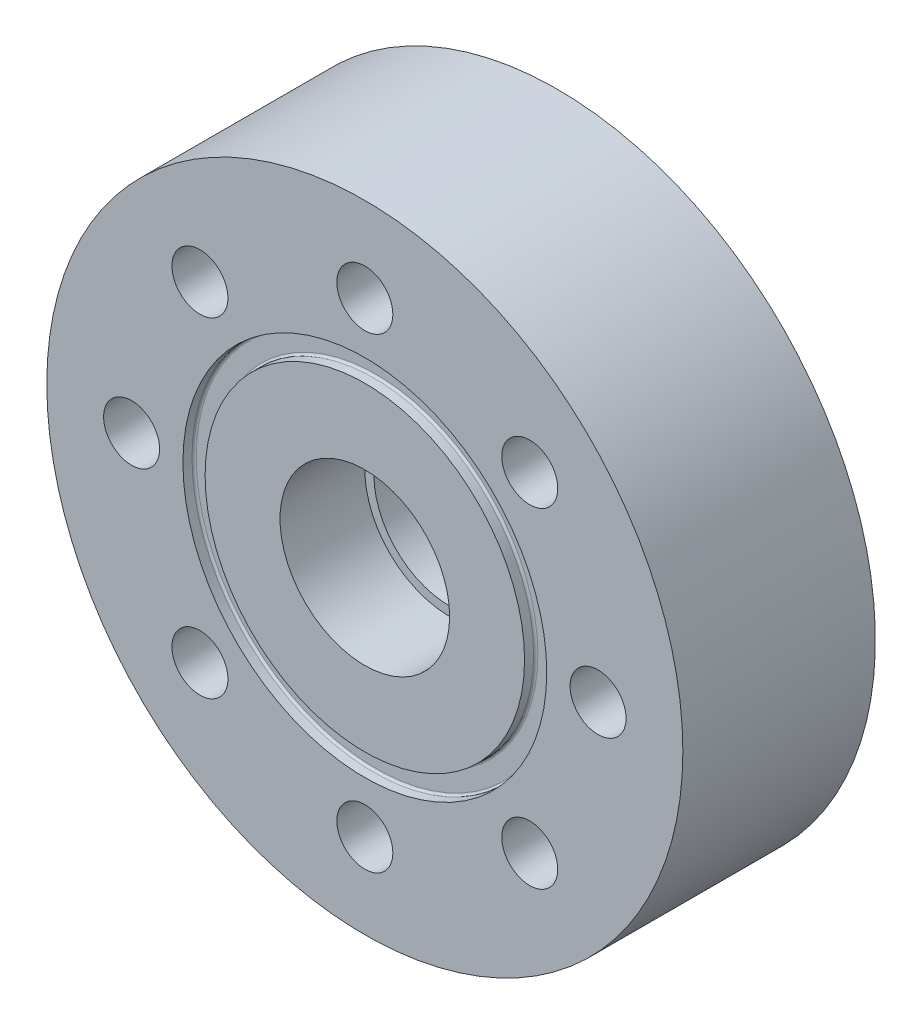
ISO-10303-21;
HEADER;
FILE_DESCRIPTION(('STEP AP214'),'2;1');
FILE_NAME('part.step','',(''),(''),'','','');
FILE_SCHEMA(('AUTOMOTIVE_DESIGN { 1 0 10303 214 1 1 1 1 }'));
ENDSEC;
DATA;
#1=APPLICATION_CONTEXT('core data for automotive mechanical design processes');
#2=APPLICATION_PROTOCOL_DEFINITION('international standard','automotive_design',2000,#1);
#3=PRODUCT_CONTEXT('',#1,'mechanical');
#4=PRODUCT('Part','Part','',(#3));
#5=PRODUCT_RELATED_PRODUCT_CATEGORY('part','',(#4));
#6=PRODUCT_DEFINITION_FORMATION('','',#4);
#7=PRODUCT_DEFINITION_CONTEXT('part definition',#1,'design');
#8=PRODUCT_DEFINITION('design','',#6,#7);
#9=PRODUCT_DEFINITION_SHAPE('','',#8);
#10=(LENGTH_UNIT() NAMED_UNIT(*) SI_UNIT(.MILLI.,.METRE.));
#11=(NAMED_UNIT(*) PLANE_ANGLE_UNIT() SI_UNIT($,.RADIAN.));
#12=(NAMED_UNIT(*) SI_UNIT($,.STERADIAN.) SOLID_ANGLE_UNIT());
#13=UNCERTAINTY_MEASURE_WITH_UNIT(LENGTH_MEASURE(1.E-05),#10,'distance_accuracy_value','');
#14=(GEOMETRIC_REPRESENTATION_CONTEXT(3) GLOBAL_UNCERTAINTY_ASSIGNED_CONTEXT((#13)) GLOBAL_UNIT_ASSIGNED_CONTEXT((#10,
#11,#12)) REPRESENTATION_CONTEXT('',''));
#15=CARTESIAN_POINT('',(0.,0.,0.));
#16=DIRECTION('',(0.,0.,1.));
#17=DIRECTION('',(1.,0.,0.));
#18=AXIS2_PLACEMENT_3D('',#15,#16,#17);
#19=CARTESIAN_POINT('',(0.,0.,10.));
#20=DIRECTION('',(0.,0.,1.));
#21=DIRECTION('',(1.,0.,0.));
#22=AXIS2_PLACEMENT_3D('',#19,#20,#21);
#23=PLANE('',#22);
#24=CARTESIAN_POINT('',(0.,0.,10.));
#25=DIRECTION('',(0.,0.,1.));
#26=DIRECTION('',(1.,0.,0.));
#27=AXIS2_PLACEMENT_3D('',#24,#25,#26);
#28=CIRCLE('',#27,10.);
#29=CARTESIAN_POINT('',(10.,0.,10.));
#30=VERTEX_POINT('',#29);
#31=EDGE_CURVE('E66',#30,#30,#28,.T.);
#32=ORIENTED_EDGE('',*,*,#31,.F.);
#33=EDGE_LOOP('',(#32));
#34=FACE_BOUND('',#33,.T.);
#35=CARTESIAN_POINT('',(0.,0.,10.));
#36=DIRECTION('',(0.,0.,1.));
#37=DIRECTION('',(1.,0.,0.));
#38=AXIS2_PLACEMENT_3D('',#35,#36,#37);
#39=CIRCLE('',#38,18.8338);
#40=CARTESIAN_POINT('',(18.8338,0.,10.));
#41=VERTEX_POINT('',#40);
#42=EDGE_CURVE('E132',#41,#41,#39,.T.);
#43=ORIENTED_EDGE('',*,*,#42,.T.);
#44=EDGE_LOOP('',(#43));
#45=FACE_BOUND('',#44,.T.);
#46=ADVANCED_FACE('F43',(#34,#45),#23,.T.);
#47=CARTESIAN_POINT('',(0.,0.,10.));
#48=DIRECTION('',(0.,0.,1.));
#49=DIRECTION('',(1.,0.,0.));
#50=AXIS2_PLACEMENT_3D('',#47,#48,#49);
#51=CIRCLE('',#50,21.45);
#52=CARTESIAN_POINT('',(21.45,0.,10.));
#53=VERTEX_POINT('',#52);
#54=EDGE_CURVE('E127',#53,#53,#51,.T.);
#55=ORIENTED_EDGE('',*,*,#54,.F.);
#56=EDGE_LOOP('',(#55));
#57=FACE_BOUND('',#56,.T.);
#58=CARTESIAN_POINT('',(-27.4999999999994,-5.69811916257121E-13,10.));
#59=DIRECTION('',(0.,0.,1.));
#60=DIRECTION('',(1.,0.,0.));
#61=AXIS2_PLACEMENT_3D('',#58,#59,#60);
#62=CIRCLE('',#61,3.302);
#63=CARTESIAN_POINT('',(-24.1979999999994,-5.69811916257121E-13,10.));
#64=VERTEX_POINT('',#63);
#65=EDGE_CURVE('E79',#64,#64,#62,.T.);
#66=ORIENTED_EDGE('',*,*,#65,.F.);
#67=EDGE_LOOP('',(#66));
#68=FACE_BOUND('',#67,.T.);
#69=CARTESIAN_POINT('',(-19.4454364826291,-19.4454364826305,10.));
#70=DIRECTION('',(0.,0.,1.));
#71=DIRECTION('',(1.,0.,0.));
#72=AXIS2_PLACEMENT_3D('',#69,#70,#71);
#73=CIRCLE('',#72,3.302);
#74=CARTESIAN_POINT('',(-16.1434364826291,-19.4454364826305,10.));
#75=VERTEX_POINT('',#74);
#76=EDGE_CURVE('E98',#75,#75,#73,.T.);
#77=ORIENTED_EDGE('',*,*,#76,.F.);
#78=EDGE_LOOP('',(#77));
#79=FACE_BOUND('',#78,.T.);
#80=CARTESIAN_POINT('',(0.,27.5,10.));
#81=DIRECTION('',(0.,0.,1.));
#82=DIRECTION('',(1.,0.,0.));
#83=AXIS2_PLACEMENT_3D('',#80,#81,#82);
#84=CIRCLE('',#83,3.302);
#85=CARTESIAN_POINT('',(3.302,27.5,10.));
#86=VERTEX_POINT('',#85);
#87=EDGE_CURVE('E92',#86,#86,#84,.T.);
#88=ORIENTED_EDGE('',*,*,#87,.F.);
#89=EDGE_LOOP('',(#88));
#90=FACE_BOUND('',#89,.T.);
#91=CARTESIAN_POINT('',(19.4454364826302,19.4454364826305,10.));
#92=DIRECTION('',(0.,0.,1.));
#93=DIRECTION('',(1.,0.,0.));
#94=AXIS2_PLACEMENT_3D('',#91,#92,#93);
#95=CIRCLE('',#94,3.302);
#96=CARTESIAN_POINT('',(22.7474364826302,19.4454364826305,10.));
#97=VERTEX_POINT('',#96);
#98=EDGE_CURVE('E85',#97,#97,#95,.T.);
#99=ORIENTED_EDGE('',*,*,#98,.F.);
#100=EDGE_LOOP('',(#99));
#101=FACE_BOUND('',#100,.T.);
#102=CARTESIAN_POINT('',(27.5000000000006,5.66444137559466E-13,10.));
#103=DIRECTION('',(0.,0.,1.));
#104=DIRECTION('',(1.,0.,0.));
#105=AXIS2_PLACEMENT_3D('',#102,#103,#104);
#106=CIRCLE('',#105,3.302);
#107=CARTESIAN_POINT('',(30.8020000000006,5.66444137559466E-13,10.));
#108=VERTEX_POINT('',#107);
#109=EDGE_CURVE('E86',#108,#108,#106,.T.);
#110=ORIENTED_EDGE('',*,*,#109,.F.);
#111=EDGE_LOOP('',(#110));
#112=FACE_BOUND('',#111,.T.);
#113=CARTESIAN_POINT('',(19.445436482631,-19.4454364826297,10.));
#114=DIRECTION('',(0.,0.,1.));
#115=DIRECTION('',(1.,0.,0.));
#116=AXIS2_PLACEMENT_3D('',#113,#114,#115);
#117=CIRCLE('',#116,3.302);
#118=CARTESIAN_POINT('',(22.747436482631,-19.4454364826297,10.));
#119=VERTEX_POINT('',#118);
#120=EDGE_CURVE('E116',#119,#119,#117,.T.);
#121=ORIENTED_EDGE('',*,*,#120,.F.);
#122=EDGE_LOOP('',(#121));
#123=FACE_BOUND('',#122,.T.);
#124=CARTESIAN_POINT('',(1.13288827511893E-12,-27.5,10.));
#125=DIRECTION('',(0.,0.,1.));
#126=DIRECTION('',(1.,0.,0.));
#127=AXIS2_PLACEMENT_3D('',#124,#125,#126);
#128=CIRCLE('',#127,3.302);
#129=CARTESIAN_POINT('',(3.30200000000113,-27.5,10.));
#130=VERTEX_POINT('',#129);
#131=EDGE_CURVE('E109',#130,#130,#128,.T.);
#132=ORIENTED_EDGE('',*,*,#131,.F.);
#133=EDGE_LOOP('',(#132));
#134=FACE_BOUND('',#133,.T.);
#135=CARTESIAN_POINT('',(-19.4454364826299,19.4454364826297,10.));
#136=DIRECTION('',(0.,0.,1.));
#137=DIRECTION('',(1.,0.,0.));
#138=AXIS2_PLACEMENT_3D('',#135,#136,#137);
#139=CIRCLE('',#138,3.302);
#140=CARTESIAN_POINT('',(-16.1434364826299,19.4454364826297,10.));
#141=VERTEX_POINT('',#140);
#142=EDGE_CURVE('E76',#141,#141,#139,.T.);
#143=ORIENTED_EDGE('',*,*,#142,.F.);
#144=EDGE_LOOP('',(#143));
#145=FACE_BOUND('',#144,.T.);
#146=CARTESIAN_POINT('',(0.,0.,10.));
#147=DIRECTION('',(0.,0.,1.));
#148=DIRECTION('',(1.,0.,0.));
#149=AXIS2_PLACEMENT_3D('',#146,#147,#148);
#150=CIRCLE('',#149,37.5);
#151=CARTESIAN_POINT('',(37.5,0.,10.));
#152=VERTEX_POINT('',#151);
#153=EDGE_CURVE('E63',#152,#152,#150,.T.);
#154=ORIENTED_EDGE('',*,*,#153,.T.);
#155=EDGE_LOOP('',(#154));
#156=FACE_BOUND('',#155,.T.);
#157=ADVANCED_FACE('F151',(#57,#68,#79,#90,#101,#112,#123,#134,#145,#156),#23,.T.);
#158=CARTESIAN_POINT('',(0.,0.,10.));
#159=DIRECTION('',(0.,0.,-1.));
#160=DIRECTION('',(-1.,0.,0.));
#161=AXIS2_PLACEMENT_3D('',#158,#159,#160);
#162=CYLINDRICAL_SURFACE('',#161,37.5);
#163=ORIENTED_EDGE('',*,*,#153,.F.);
#164=EDGE_LOOP('',(#163));
#165=FACE_BOUND('',#164,.T.);
#166=CARTESIAN_POINT('',(0.,0.,-12.7));
#167=DIRECTION('',(0.,0.,-1.));
#168=DIRECTION('',(-1.,0.,0.));
#169=AXIS2_PLACEMENT_3D('',#166,#167,#168);
#170=CIRCLE('',#169,37.5);
#171=CARTESIAN_POINT('',(-37.5,0.,-12.7));
#172=VERTEX_POINT('',#171);
#173=EDGE_CURVE('E70',#172,#172,#170,.T.);
#174=ORIENTED_EDGE('',*,*,#173,.F.);
#175=EDGE_LOOP('',(#174));
#176=FACE_BOUND('',#175,.T.);
#177=ADVANCED_FACE('F157',(#165,#176),#162,.T.);
#178=CARTESIAN_POINT('',(0.,0.,10.));
#179=DIRECTION('',(0.,0.,-1.));
#180=DIRECTION('',(-1.,0.,0.));
#181=AXIS2_PLACEMENT_3D('',#178,#179,#180);
#182=CYLINDRICAL_SURFACE('',#181,10.);
#183=ORIENTED_EDGE('',*,*,#31,.T.);
#184=EDGE_LOOP('',(#183));
#185=FACE_BOUND('',#184,.T.);
#186=CARTESIAN_POINT('',(0.,0.,0.));
#187=DIRECTION('',(0.,0.,1.));
#188=DIRECTION('',(1.,0.,0.));
#189=AXIS2_PLACEMENT_3D('',#186,#187,#188);
#190=CIRCLE('',#189,10.);
#191=CARTESIAN_POINT('',(10.,0.,0.));
#192=VERTEX_POINT('',#191);
#193=EDGE_CURVE('E67',#192,#192,#190,.T.);
#194=ORIENTED_EDGE('',*,*,#193,.F.);
#195=EDGE_LOOP('',(#194));
#196=FACE_BOUND('',#195,.T.);
#197=ADVANCED_FACE('F162',(#185,#196),#182,.F.);
#198=CARTESIAN_POINT('',(0.,0.,0.));
#199=DIRECTION('',(0.,0.,-1.));
#200=DIRECTION('',(-1.,0.,0.));
#201=AXIS2_PLACEMENT_3D('',#198,#199,#200);
#202=PLANE('',#201);
#203=CARTESIAN_POINT('',(0.,0.,0.));
#204=DIRECTION('',(0.,0.,-1.));
#205=DIRECTION('',(-1.,0.,0.));
#206=AXIS2_PLACEMENT_3D('',#203,#204,#205);
#207=CIRCLE('',#206,8.9296875);
#208=CARTESIAN_POINT('',(-8.9296875,0.,0.));
#209=VERTEX_POINT('',#208);
#210=EDGE_CURVE('E110',#209,#209,#207,.T.);
#211=ORIENTED_EDGE('',*,*,#210,.T.);
#212=EDGE_LOOP('',(#211));
#213=FACE_BOUND('',#212,.T.);
#214=ORIENTED_EDGE('',*,*,#193,.T.);
#215=EDGE_LOOP('',(#214));
#216=FACE_BOUND('',#215,.T.);
#217=ADVANCED_FACE('F169',(#213,#216),#202,.F.);
#218=CARTESIAN_POINT('',(0.,0.,-12.7));
#219=DIRECTION('',(0.,0.,-1.));
#220=DIRECTION('',(-1.,0.,0.));
#221=AXIS2_PLACEMENT_3D('',#218,#219,#220);
#222=PLANE('',#221);
#223=CARTESIAN_POINT('',(0.,0.,-12.7));
#224=DIRECTION('',(0.,0.,-1.));
#225=DIRECTION('',(-1.,0.,0.));
#226=AXIS2_PLACEMENT_3D('',#223,#224,#225);
#227=CIRCLE('',#226,8.9296875);
#228=CARTESIAN_POINT('',(-8.9296875,0.,-12.7));
#229=VERTEX_POINT('',#228);
#230=EDGE_CURVE('E124',#229,#229,#227,.T.);
#231=ORIENTED_EDGE('',*,*,#230,.F.);
#232=EDGE_LOOP('',(#231));
#233=FACE_BOUND('',#232,.T.);
#234=CARTESIAN_POINT('',(-27.4999999999994,-5.69811916257121E-13,-12.7));
#235=DIRECTION('',(0.,0.,1.));
#236=DIRECTION('',(1.,0.,0.));
#237=AXIS2_PLACEMENT_3D('',#234,#235,#236);
#238=CIRCLE('',#237,3.302);
#239=CARTESIAN_POINT('',(-24.1979999999994,-5.69811916257121E-13,-12.7));
#240=VERTEX_POINT('',#239);
#241=EDGE_CURVE('E101',#240,#240,#238,.T.);
#242=ORIENTED_EDGE('',*,*,#241,.T.);
#243=EDGE_LOOP('',(#242));
#244=FACE_BOUND('',#243,.T.);
#245=CARTESIAN_POINT('',(-19.4454364826291,-19.4454364826305,-12.7));
#246=DIRECTION('',(0.,0.,1.));
#247=DIRECTION('',(1.,0.,0.));
#248=AXIS2_PLACEMENT_3D('',#245,#246,#247);
#249=CIRCLE('',#248,3.302);
#250=CARTESIAN_POINT('',(-16.1434364826291,-19.4454364826305,-12.7));
#251=VERTEX_POINT('',#250);
#252=EDGE_CURVE('E95',#251,#251,#249,.T.);
#253=ORIENTED_EDGE('',*,*,#252,.T.);
#254=EDGE_LOOP('',(#253));
#255=FACE_BOUND('',#254,.T.);
#256=CARTESIAN_POINT('',(0.,27.5,-12.7));
#257=DIRECTION('',(0.,0.,1.));
#258=DIRECTION('',(1.,0.,0.));
#259=AXIS2_PLACEMENT_3D('',#256,#257,#258);
#260=CIRCLE('',#259,3.302);
#261=CARTESIAN_POINT('',(3.302,27.5,-12.7));
#262=VERTEX_POINT('',#261);
#263=EDGE_CURVE('E89',#262,#262,#260,.T.);
#264=ORIENTED_EDGE('',*,*,#263,.T.);
#265=EDGE_LOOP('',(#264));
#266=FACE_BOUND('',#265,.T.);
#267=CARTESIAN_POINT('',(19.4454364826302,19.4454364826305,-12.7));
#268=DIRECTION('',(0.,0.,1.));
#269=DIRECTION('',(1.,0.,0.));
#270=AXIS2_PLACEMENT_3D('',#267,#268,#269);
#271=CIRCLE('',#270,3.302);
#272=CARTESIAN_POINT('',(22.7474364826302,19.4454364826305,-12.7));
#273=VERTEX_POINT('',#272);
#274=EDGE_CURVE('E82',#273,#273,#271,.T.);
#275=ORIENTED_EDGE('',*,*,#274,.T.);
#276=EDGE_LOOP('',(#275));
#277=FACE_BOUND('',#276,.T.);
#278=CARTESIAN_POINT('',(27.5000000000006,5.66444137559466E-13,-12.7));
#279=DIRECTION('',(0.,0.,1.));
#280=DIRECTION('',(1.,0.,0.));
#281=AXIS2_PLACEMENT_3D('',#278,#279,#280);
#282=CIRCLE('',#281,3.302);
#283=CARTESIAN_POINT('',(30.8020000000006,5.66444137559466E-13,-12.7));
#284=VERTEX_POINT('',#283);
#285=EDGE_CURVE('E119',#284,#284,#282,.T.);
#286=ORIENTED_EDGE('',*,*,#285,.T.);
#287=EDGE_LOOP('',(#286));
#288=FACE_BOUND('',#287,.T.);
#289=CARTESIAN_POINT('',(19.445436482631,-19.4454364826297,-12.7));
#290=DIRECTION('',(0.,0.,1.));
#291=DIRECTION('',(1.,0.,0.));
#292=AXIS2_PLACEMENT_3D('',#289,#290,#291);
#293=CIRCLE('',#292,3.302);
#294=CARTESIAN_POINT('',(22.747436482631,-19.4454364826297,-12.7));
#295=VERTEX_POINT('',#294);
#296=EDGE_CURVE('E113',#295,#295,#293,.T.);
#297=ORIENTED_EDGE('',*,*,#296,.T.);
#298=EDGE_LOOP('',(#297));
#299=FACE_BOUND('',#298,.T.);
#300=CARTESIAN_POINT('',(1.13288827511893E-12,-27.5,-12.7));
#301=DIRECTION('',(0.,0.,1.));
#302=DIRECTION('',(1.,0.,0.));
#303=AXIS2_PLACEMENT_3D('',#300,#301,#302);
#304=CIRCLE('',#303,3.302);
#305=CARTESIAN_POINT('',(3.30200000000113,-27.5,-12.7));
#306=VERTEX_POINT('',#305);
#307=EDGE_CURVE('E106',#306,#306,#304,.T.);
#308=ORIENTED_EDGE('',*,*,#307,.T.);
#309=EDGE_LOOP('',(#308));
#310=FACE_BOUND('',#309,.T.);
#311=CARTESIAN_POINT('',(-19.4454364826299,19.4454364826297,-12.7));
#312=DIRECTION('',(0.,0.,1.));
#313=DIRECTION('',(1.,0.,0.));
#314=AXIS2_PLACEMENT_3D('',#311,#312,#313);
#315=CIRCLE('',#314,3.302);
#316=CARTESIAN_POINT('',(-16.1434364826299,19.4454364826297,-12.7));
#317=VERTEX_POINT('',#316);
#318=EDGE_CURVE('E75',#317,#317,#315,.T.);
#319=ORIENTED_EDGE('',*,*,#318,.T.);
#320=EDGE_LOOP('',(#319));
#321=FACE_BOUND('',#320,.T.);
#322=ORIENTED_EDGE('',*,*,#173,.T.);
#323=EDGE_LOOP('',(#322));
#324=FACE_BOUND('',#323,.T.);
#325=ADVANCED_FACE('F175',(#233,#244,#255,#266,#277,#288,#299,#310,#321,#324),#222,.T.);
#326=CARTESIAN_POINT('',(-19.4454364826299,19.4454364826297,-12.7));
#327=DIRECTION('',(0.,0.,1.));
#328=DIRECTION('',(1.,0.,0.));
#329=AXIS2_PLACEMENT_3D('',#326,#327,#328);
#330=CYLINDRICAL_SURFACE('',#329,3.302);
#331=ORIENTED_EDGE('',*,*,#318,.F.);
#332=EDGE_LOOP('',(#331));
#333=FACE_BOUND('',#332,.T.);
#334=ORIENTED_EDGE('',*,*,#142,.T.);
#335=EDGE_LOOP('',(#334));
#336=FACE_BOUND('',#335,.T.);
#337=ADVANCED_FACE('F177',(#333,#336),#330,.F.);
#338=CARTESIAN_POINT('',(1.13288827511893E-12,-27.5,-12.7));
#339=DIRECTION('',(0.,0.,1.));
#340=DIRECTION('',(1.,0.,0.));
#341=AXIS2_PLACEMENT_3D('',#338,#339,#340);
#342=CYLINDRICAL_SURFACE('',#341,3.302);
#343=ORIENTED_EDGE('',*,*,#131,.T.);
#344=EDGE_LOOP('',(#343));
#345=FACE_BOUND('',#344,.T.);
#346=ORIENTED_EDGE('',*,*,#307,.F.);
#347=EDGE_LOOP('',(#346));
#348=FACE_BOUND('',#347,.T.);
#349=ADVANCED_FACE('F184',(#345,#348),#342,.F.);
#350=CARTESIAN_POINT('',(19.445436482631,-19.4454364826297,-12.7));
#351=DIRECTION('',(0.,0.,1.));
#352=DIRECTION('',(1.,0.,0.));
#353=AXIS2_PLACEMENT_3D('',#350,#351,#352);
#354=CYLINDRICAL_SURFACE('',#353,3.302);
#355=ORIENTED_EDGE('',*,*,#296,.F.);
#356=EDGE_LOOP('',(#355));
#357=FACE_BOUND('',#356,.T.);
#358=ORIENTED_EDGE('',*,*,#120,.T.);
#359=EDGE_LOOP('',(#358));
#360=FACE_BOUND('',#359,.T.);
#361=ADVANCED_FACE('F211',(#357,#360),#354,.F.);
#362=CARTESIAN_POINT('',(27.5000000000006,5.66444137559466E-13,-12.7));
#363=DIRECTION('',(0.,0.,1.));
#364=DIRECTION('',(1.,0.,0.));
#365=AXIS2_PLACEMENT_3D('',#362,#363,#364);
#366=CYLINDRICAL_SURFACE('',#365,3.302);
#367=ORIENTED_EDGE('',*,*,#285,.F.);
#368=EDGE_LOOP('',(#367));
#369=FACE_BOUND('',#368,.T.);
#370=ORIENTED_EDGE('',*,*,#109,.T.);
#371=EDGE_LOOP('',(#370));
#372=FACE_BOUND('',#371,.T.);
#373=ADVANCED_FACE('F195',(#369,#372),#366,.F.);
#374=CARTESIAN_POINT('',(19.4454364826302,19.4454364826305,-12.7));
#375=DIRECTION('',(0.,0.,1.));
#376=DIRECTION('',(1.,0.,0.));
#377=AXIS2_PLACEMENT_3D('',#374,#375,#376);
#378=CYLINDRICAL_SURFACE('',#377,3.302);
#379=ORIENTED_EDGE('',*,*,#274,.F.);
#380=EDGE_LOOP('',(#379));
#381=FACE_BOUND('',#380,.T.);
#382=ORIENTED_EDGE('',*,*,#98,.T.);
#383=EDGE_LOOP('',(#382));
#384=FACE_BOUND('',#383,.T.);
#385=ADVANCED_FACE('F191',(#381,#384),#378,.F.);
#386=CARTESIAN_POINT('',(0.,27.5,-12.7));
#387=DIRECTION('',(0.,0.,1.));
#388=DIRECTION('',(1.,0.,0.));
#389=AXIS2_PLACEMENT_3D('',#386,#387,#388);
#390=CYLINDRICAL_SURFACE('',#389,3.302);
#391=ORIENTED_EDGE('',*,*,#263,.F.);
#392=EDGE_LOOP('',(#391));
#393=FACE_BOUND('',#392,.T.);
#394=ORIENTED_EDGE('',*,*,#87,.T.);
#395=EDGE_LOOP('',(#394));
#396=FACE_BOUND('',#395,.T.);
#397=ADVANCED_FACE('F194',(#393,#396),#390,.F.);
#398=CARTESIAN_POINT('',(-19.4454364826291,-19.4454364826305,-12.7));
#399=DIRECTION('',(0.,0.,1.));
#400=DIRECTION('',(1.,0.,0.));
#401=AXIS2_PLACEMENT_3D('',#398,#399,#400);
#402=CYLINDRICAL_SURFACE('',#401,3.302);
#403=ORIENTED_EDGE('',*,*,#252,.F.);
#404=EDGE_LOOP('',(#403));
#405=FACE_BOUND('',#404,.T.);
#406=ORIENTED_EDGE('',*,*,#76,.T.);
#407=EDGE_LOOP('',(#406));
#408=FACE_BOUND('',#407,.T.);
#409=ADVANCED_FACE('F199',(#405,#408),#402,.F.);
#410=CARTESIAN_POINT('',(-27.4999999999994,-5.69811916257121E-13,-12.7));
#411=DIRECTION('',(0.,0.,1.));
#412=DIRECTION('',(1.,0.,0.));
#413=AXIS2_PLACEMENT_3D('',#410,#411,#412);
#414=CYLINDRICAL_SURFACE('',#413,3.302);
#415=ORIENTED_EDGE('',*,*,#241,.F.);
#416=EDGE_LOOP('',(#415));
#417=FACE_BOUND('',#416,.T.);
#418=ORIENTED_EDGE('',*,*,#65,.T.);
#419=EDGE_LOOP('',(#418));
#420=FACE_BOUND('',#419,.T.);
#421=ADVANCED_FACE('F203',(#417,#420),#414,.F.);
#422=CARTESIAN_POINT('',(0.,0.,0.));
#423=DIRECTION('',(0.,0.,-1.));
#424=DIRECTION('',(-1.,0.,0.));
#425=AXIS2_PLACEMENT_3D('',#422,#423,#424);
#426=CYLINDRICAL_SURFACE('',#425,8.9296875);
#427=ORIENTED_EDGE('',*,*,#210,.F.);
#428=EDGE_LOOP('',(#427));
#429=FACE_BOUND('',#428,.T.);
#430=ORIENTED_EDGE('',*,*,#230,.T.);
#431=EDGE_LOOP('',(#430));
#432=FACE_BOUND('',#431,.T.);
#433=ADVANCED_FACE('F207',(#429,#432),#426,.F.);
#434=CARTESIAN_POINT('',(0.,0.,8.6792));
#435=DIRECTION('',(0.,0.,1.));
#436=DIRECTION('',(1.,0.,0.));
#437=AXIS2_PLACEMENT_3D('',#434,#435,#436);
#438=CYLINDRICAL_SURFACE('',#437,21.45);
#439=CARTESIAN_POINT('',(0.,0.,8.9332));
#440=DIRECTION('',(0.,0.,1.));
#441=DIRECTION('',(1.,0.,0.));
#442=AXIS2_PLACEMENT_3D('',#439,#440,#441);
#443=CIRCLE('',#442,21.45);
#444=CARTESIAN_POINT('',(21.45,0.,8.9332));
#445=VERTEX_POINT('',#444);
#446=EDGE_CURVE('E11',#445,#445,#443,.F.);
#447=ORIENTED_EDGE('',*,*,#446,.T.);
#448=EDGE_LOOP('',(#447));
#449=FACE_BOUND('',#448,.T.);
#450=ORIENTED_EDGE('',*,*,#54,.T.);
#451=EDGE_LOOP('',(#450));
#452=FACE_BOUND('',#451,.T.);
#453=ADVANCED_FACE('F148',(#449,#452),#438,.F.);
#454=CARTESIAN_POINT('',(0.,0.,8.6792));
#455=DIRECTION('',(0.,0.,1.));
#456=DIRECTION('',(1.,0.,0.));
#457=AXIS2_PLACEMENT_3D('',#454,#455,#456);
#458=PLANE('',#457);
#459=CARTESIAN_POINT('',(0.,0.,8.6792));
#460=DIRECTION('',(0.,0.,1.));
#461=DIRECTION('',(1.,0.,0.));
#462=AXIS2_PLACEMENT_3D('',#459,#460,#461);
#463=CIRCLE('',#462,19.0878);
#464=CARTESIAN_POINT('',(19.0878,0.,8.6792));
#465=VERTEX_POINT('',#464);
#466=EDGE_CURVE('E50',#465,#465,#463,.F.);
#467=ORIENTED_EDGE('',*,*,#466,.T.);
#468=EDGE_LOOP('',(#467));
#469=FACE_BOUND('',#468,.T.);
#470=CARTESIAN_POINT('',(0.,0.,8.6792));
#471=DIRECTION('',(0.,0.,1.));
#472=DIRECTION('',(1.,0.,0.));
#473=AXIS2_PLACEMENT_3D('',#470,#471,#472);
#474=CIRCLE('',#473,21.196);
#475=CARTESIAN_POINT('',(21.196,0.,8.6792));
#476=VERTEX_POINT('',#475);
#477=EDGE_CURVE('E54',#476,#476,#474,.T.);
#478=ORIENTED_EDGE('',*,*,#477,.T.);
#479=EDGE_LOOP('',(#478));
#480=FACE_BOUND('',#479,.T.);
#481=ADVANCED_FACE('F140',(#469,#480),#458,.T.);
#482=CARTESIAN_POINT('',(0.,0.,8.6792));
#483=DIRECTION('',(0.,0.,1.));
#484=DIRECTION('',(1.,0.,0.));
#485=AXIS2_PLACEMENT_3D('',#482,#483,#484);
#486=CYLINDRICAL_SURFACE('',#485,18.8338);
#487=CARTESIAN_POINT('',(0.,0.,8.9332));
#488=DIRECTION('',(0.,0.,1.));
#489=DIRECTION('',(1.,0.,0.));
#490=AXIS2_PLACEMENT_3D('',#487,#488,#489);
#491=CIRCLE('',#490,18.8338);
#492=CARTESIAN_POINT('',(18.8338,0.,8.9332));
#493=VERTEX_POINT('',#492);
#494=EDGE_CURVE('E58',#493,#493,#491,.T.);
#495=ORIENTED_EDGE('',*,*,#494,.T.);
#496=EDGE_LOOP('',(#495));
#497=FACE_BOUND('',#496,.T.);
#498=ORIENTED_EDGE('',*,*,#42,.F.);
#499=EDGE_LOOP('',(#498));
#500=FACE_BOUND('',#499,.T.);
#501=ADVANCED_FACE('F137',(#497,#500),#486,.T.);
#502=CARTESIAN_POINT('',(0.,0.,8.9332));
#503=DIRECTION('',(0.,0.,1.));
#504=DIRECTION('',(1.,0.,0.));
#505=AXIS2_PLACEMENT_3D('',#502,#503,#504);
#506=TOROIDAL_SURFACE('',#505,19.0878,0.254);
#507=ORIENTED_EDGE('',*,*,#466,.F.);
#508=EDGE_LOOP('',(#507));
#509=FACE_BOUND('',#508,.T.);
#510=ORIENTED_EDGE('',*,*,#494,.F.);
#511=EDGE_LOOP('',(#510));
#512=FACE_BOUND('',#511,.T.);
#513=ADVANCED_FACE('F139',(#509,#512),#506,.F.);
#514=CARTESIAN_POINT('',(0.,0.,8.9332));
#515=DIRECTION('',(0.,0.,1.));
#516=DIRECTION('',(1.,0.,0.));
#517=AXIS2_PLACEMENT_3D('',#514,#515,#516);
#518=TOROIDAL_SURFACE('',#517,21.196,0.254);
#519=ORIENTED_EDGE('',*,*,#446,.F.);
#520=EDGE_LOOP('',(#519));
#521=FACE_BOUND('',#520,.T.);
#522=ORIENTED_EDGE('',*,*,#477,.F.);
#523=EDGE_LOOP('',(#522));
#524=FACE_BOUND('',#523,.T.);
#525=ADVANCED_FACE('F45',(#521,#524),#518,.F.);
#526=CLOSED_SHELL('',(#46,#157,#177,#197,#217,#325,#337,#349,#361,#373,#385,#397,#409,#421,#433,
#453,#481,#501,#513,#525));
#527=MANIFOLD_SOLID_BREP('B2',#526);
#528=ADVANCED_BREP_SHAPE_REPRESENTATION('',(#18,#527),#14);
#529=SHAPE_DEFINITION_REPRESENTATION(#9,#528);
ENDSEC;
END-ISO-10303-21;
